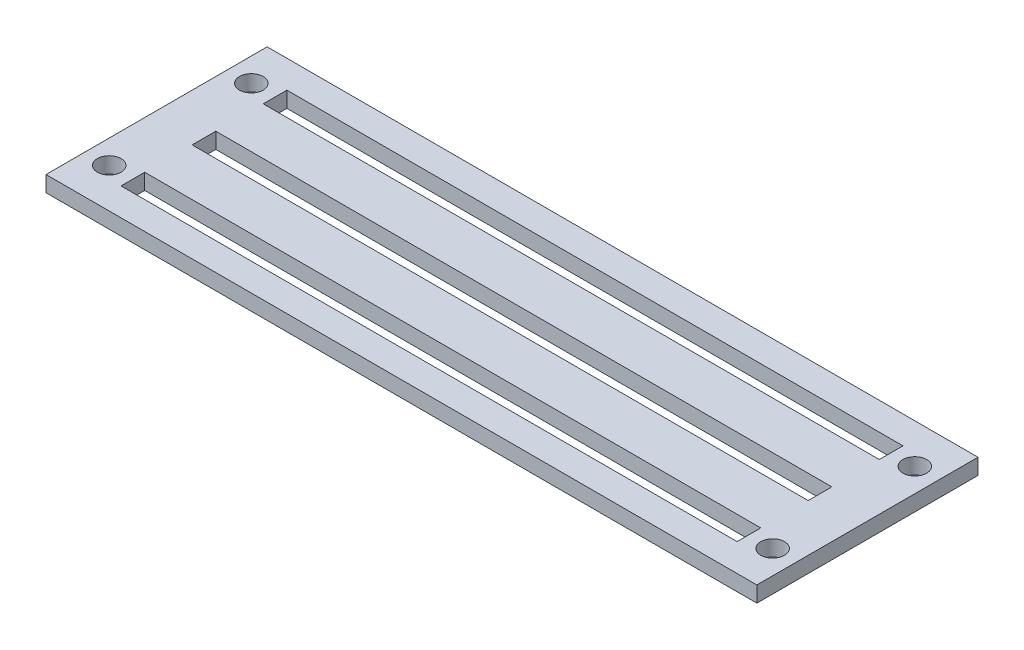
ISO-10303-21;
HEADER;
FILE_DESCRIPTION(('STEP AP214'),'2;1');
FILE_NAME('part.step','',(''),(''),'','','');
FILE_SCHEMA(('AUTOMOTIVE_DESIGN { 1 0 10303 214 1 1 1 1 }'));
ENDSEC;
DATA;
#1=APPLICATION_CONTEXT('core data for automotive mechanical design processes');
#2=APPLICATION_PROTOCOL_DEFINITION('international standard','automotive_design',2000,#1);
#3=PRODUCT_CONTEXT('',#1,'mechanical');
#4=PRODUCT('Part','Part','',(#3));
#5=PRODUCT_RELATED_PRODUCT_CATEGORY('part','',(#4));
#6=PRODUCT_DEFINITION_FORMATION('','',#4);
#7=PRODUCT_DEFINITION_CONTEXT('part definition',#1,'design');
#8=PRODUCT_DEFINITION('design','',#6,#7);
#9=PRODUCT_DEFINITION_SHAPE('','',#8);
#10=(LENGTH_UNIT() NAMED_UNIT(*) SI_UNIT(.MILLI.,.METRE.));
#11=(NAMED_UNIT(*) PLANE_ANGLE_UNIT() SI_UNIT($,.RADIAN.));
#12=(NAMED_UNIT(*) SI_UNIT($,.STERADIAN.) SOLID_ANGLE_UNIT());
#13=UNCERTAINTY_MEASURE_WITH_UNIT(LENGTH_MEASURE(1.E-05),#10,'distance_accuracy_value','');
#14=(GEOMETRIC_REPRESENTATION_CONTEXT(3) GLOBAL_UNCERTAINTY_ASSIGNED_CONTEXT((#13)) GLOBAL_UNIT_ASSIGNED_CONTEXT((#10,
#11,#12)) REPRESENTATION_CONTEXT('',''));
#15=CARTESIAN_POINT('',(0.,0.,0.));
#16=DIRECTION('',(0.,0.,1.));
#17=DIRECTION('',(1.,0.,0.));
#18=AXIS2_PLACEMENT_3D('',#15,#16,#17);
#19=CARTESIAN_POINT('',(0.,2.,0.));
#20=DIRECTION('',(1.,0.,0.));
#21=DIRECTION('',(0.,0.,-1.));
#22=AXIS2_PLACEMENT_3D('',#19,#20,#21);
#23=PLANE('',#22);
#24=DIRECTION('',(0.,0.,1.));
#25=VECTOR('',#24,1.);
#26=CARTESIAN_POINT('',(0.,0.,0.));
#27=LINE('',#26,#25);
#28=CARTESIAN_POINT('',(0.,0.,-28.));
#29=VERTEX_POINT('',#28);
#30=CARTESIAN_POINT('',(0.,0.,0.));
#31=VERTEX_POINT('',#30);
#32=EDGE_CURVE('E312',#29,#31,#27,.T.);
#33=ORIENTED_EDGE('',*,*,#32,.T.);
#34=DIRECTION('',(0.,-1.,0.));
#35=VECTOR('',#34,1.);
#36=CARTESIAN_POINT('',(0.,2.,0.));
#37=LINE('',#36,#35);
#38=CARTESIAN_POINT('',(0.,2.,0.));
#39=VERTEX_POINT('',#38);
#40=EDGE_CURVE('E11',#39,#31,#37,.T.);
#41=ORIENTED_EDGE('',*,*,#40,.F.);
#42=DIRECTION('',(0.,0.,1.));
#43=VECTOR('',#42,1.);
#44=CARTESIAN_POINT('',(0.,2.,0.));
#45=LINE('',#44,#43);
#46=CARTESIAN_POINT('',(0.,2.,-28.));
#47=VERTEX_POINT('',#46);
#48=EDGE_CURVE('E322',#47,#39,#45,.T.);
#49=ORIENTED_EDGE('',*,*,#48,.F.);
#50=DIRECTION('',(0.,-1.,0.));
#51=VECTOR('',#50,1.);
#52=CARTESIAN_POINT('',(0.,2.,-28.));
#53=LINE('',#52,#51);
#54=EDGE_CURVE('E336',#47,#29,#53,.T.);
#55=ORIENTED_EDGE('',*,*,#54,.T.);
#56=EDGE_LOOP('',(#33,#41,#49,#55));
#57=FACE_BOUND('',#56,.T.);
#58=ADVANCED_FACE('F39',(#57),#23,.F.);
#59=CARTESIAN_POINT('',(0.,2.,0.));
#60=DIRECTION('',(0.,0.,-1.));
#61=DIRECTION('',(-1.,0.,0.));
#62=AXIS2_PLACEMENT_3D('',#59,#60,#61);
#63=PLANE('',#62);
#64=DIRECTION('',(1.,0.,0.));
#65=VECTOR('',#64,1.);
#66=CARTESIAN_POINT('',(0.,0.,0.));
#67=LINE('',#66,#65);
#68=CARTESIAN_POINT('',(90.,0.,0.));
#69=VERTEX_POINT('',#68);
#70=EDGE_CURVE('E340',#31,#69,#67,.T.);
#71=ORIENTED_EDGE('',*,*,#70,.T.);
#72=DIRECTION('',(0.,-1.,0.));
#73=VECTOR('',#72,1.);
#74=CARTESIAN_POINT('',(90.,2.,0.));
#75=LINE('',#74,#73);
#76=CARTESIAN_POINT('',(90.,2.,0.));
#77=VERTEX_POINT('',#76);
#78=EDGE_CURVE('E47',#77,#69,#75,.T.);
#79=ORIENTED_EDGE('',*,*,#78,.F.);
#80=DIRECTION('',(1.,0.,0.));
#81=VECTOR('',#80,1.);
#82=CARTESIAN_POINT('',(0.,2.,0.));
#83=LINE('',#82,#81);
#84=EDGE_CURVE('E326',#39,#77,#83,.T.);
#85=ORIENTED_EDGE('',*,*,#84,.F.);
#86=ORIENTED_EDGE('',*,*,#40,.T.);
#87=EDGE_LOOP('',(#71,#79,#85,#86));
#88=FACE_BOUND('',#87,.T.);
#89=ADVANCED_FACE('F375',(#88),#63,.F.);
#90=CARTESIAN_POINT('',(90.,2.,0.));
#91=DIRECTION('',(-1.,0.,0.));
#92=DIRECTION('',(0.,0.,1.));
#93=AXIS2_PLACEMENT_3D('',#90,#91,#92);
#94=PLANE('',#93);
#95=DIRECTION('',(0.,0.,-1.));
#96=VECTOR('',#95,1.);
#97=CARTESIAN_POINT('',(90.,0.,0.));
#98=LINE('',#97,#96);
#99=CARTESIAN_POINT('',(90.,0.,-28.));
#100=VERTEX_POINT('',#99);
#101=EDGE_CURVE('E343',#69,#100,#98,.T.);
#102=ORIENTED_EDGE('',*,*,#101,.T.);
#103=DIRECTION('',(0.,-1.,0.));
#104=VECTOR('',#103,1.);
#105=CARTESIAN_POINT('',(90.,2.,-28.));
#106=LINE('',#105,#104);
#107=CARTESIAN_POINT('',(90.,2.,-28.));
#108=VERTEX_POINT('',#107);
#109=EDGE_CURVE('E351',#108,#100,#106,.T.);
#110=ORIENTED_EDGE('',*,*,#109,.F.);
#111=DIRECTION('',(0.,0.,-1.));
#112=VECTOR('',#111,1.);
#113=CARTESIAN_POINT('',(90.,2.,0.));
#114=LINE('',#113,#112);
#115=EDGE_CURVE('E330',#77,#108,#114,.T.);
#116=ORIENTED_EDGE('',*,*,#115,.F.);
#117=ORIENTED_EDGE('',*,*,#78,.T.);
#118=EDGE_LOOP('',(#102,#110,#116,#117));
#119=FACE_BOUND('',#118,.T.);
#120=ADVANCED_FACE('F360',(#119),#94,.F.);
#121=CARTESIAN_POINT('',(0.,2.,-28.));
#122=DIRECTION('',(0.,0.,1.));
#123=DIRECTION('',(1.,0.,0.));
#124=AXIS2_PLACEMENT_3D('',#121,#122,#123);
#125=PLANE('',#124);
#126=DIRECTION('',(-1.,0.,0.));
#127=VECTOR('',#126,1.);
#128=CARTESIAN_POINT('',(0.,0.,-28.));
#129=LINE('',#128,#127);
#130=EDGE_CURVE('E327',#100,#29,#129,.T.);
#131=ORIENTED_EDGE('',*,*,#130,.T.);
#132=ORIENTED_EDGE('',*,*,#54,.F.);
#133=DIRECTION('',(-1.,0.,0.));
#134=VECTOR('',#133,1.);
#135=CARTESIAN_POINT('',(0.,2.,-28.));
#136=LINE('',#135,#134);
#137=EDGE_CURVE('E333',#108,#47,#136,.T.);
#138=ORIENTED_EDGE('',*,*,#137,.F.);
#139=ORIENTED_EDGE('',*,*,#109,.T.);
#140=EDGE_LOOP('',(#131,#132,#138,#139));
#141=FACE_BOUND('',#140,.T.);
#142=ADVANCED_FACE('F368',(#141),#125,.F.);
#143=CARTESIAN_POINT('',(0.,2.,0.));
#144=DIRECTION('',(0.,-1.,0.));
#145=DIRECTION('',(0.,0.,-1.));
#146=AXIS2_PLACEMENT_3D('',#143,#144,#145);
#147=PLANE('',#146);
#148=CARTESIAN_POINT('',(3.,2.,-23.));
#149=DIRECTION('',(0.,1.,0.));
#150=DIRECTION('',(0.,0.,1.));
#151=AXIS2_PLACEMENT_3D('',#148,#149,#150);
#152=CIRCLE('',#151,1.5);
#153=CARTESIAN_POINT('',(3.,2.,-21.5));
#154=VERTEX_POINT('',#153);
#155=EDGE_CURVE('E251',#154,#154,#152,.T.);
#156=ORIENTED_EDGE('',*,*,#155,.F.);
#157=EDGE_LOOP('',(#156));
#158=FACE_BOUND('',#157,.T.);
#159=CARTESIAN_POINT('',(3.,2.,-4.99999999999999));
#160=DIRECTION('',(0.,1.,0.));
#161=DIRECTION('',(0.,0.,1.));
#162=AXIS2_PLACEMENT_3D('',#159,#160,#161);
#163=CIRCLE('',#162,1.5);
#164=CARTESIAN_POINT('',(3.,2.,-3.49999999999999));
#165=VERTEX_POINT('',#164);
#166=EDGE_CURVE('E259',#165,#165,#163,.T.);
#167=ORIENTED_EDGE('',*,*,#166,.F.);
#168=EDGE_LOOP('',(#167));
#169=FACE_BOUND('',#168,.T.);
#170=CARTESIAN_POINT('',(87.,2.,-5.));
#171=DIRECTION('',(0.,1.,0.));
#172=DIRECTION('',(0.,0.,1.));
#173=AXIS2_PLACEMENT_3D('',#170,#171,#172);
#174=CIRCLE('',#173,1.5);
#175=CARTESIAN_POINT('',(87.,2.,-3.5));
#176=VERTEX_POINT('',#175);
#177=EDGE_CURVE('E267',#176,#176,#174,.T.);
#178=ORIENTED_EDGE('',*,*,#177,.F.);
#179=EDGE_LOOP('',(#178));
#180=FACE_BOUND('',#179,.T.);
#181=CARTESIAN_POINT('',(87.,2.,-23.));
#182=DIRECTION('',(0.,1.,0.));
#183=DIRECTION('',(0.,0.,1.));
#184=AXIS2_PLACEMENT_3D('',#181,#182,#183);
#185=CIRCLE('',#184,1.5);
#186=CARTESIAN_POINT('',(87.,2.,-21.5));
#187=VERTEX_POINT('',#186);
#188=EDGE_CURVE('E199',#187,#187,#185,.T.);
#189=ORIENTED_EDGE('',*,*,#188,.F.);
#190=EDGE_LOOP('',(#189));
#191=FACE_BOUND('',#190,.T.);
#192=DIRECTION('',(-1.,0.,0.));
#193=VECTOR('',#192,1.);
#194=CARTESIAN_POINT('',(84.,2.,-6.5));
#195=LINE('',#194,#193);
#196=CARTESIAN_POINT('',(84.,2.,-6.5));
#197=VERTEX_POINT('',#196);
#198=CARTESIAN_POINT('',(6.,2.,-6.49999999999999));
#199=VERTEX_POINT('',#198);
#200=EDGE_CURVE('E189',#197,#199,#195,.T.);
#201=ORIENTED_EDGE('',*,*,#200,.F.);
#202=DIRECTION('',(0.,0.,-1.));
#203=VECTOR('',#202,1.);
#204=CARTESIAN_POINT('',(84.,2.,-6.5));
#205=LINE('',#204,#203);
#206=CARTESIAN_POINT('',(84.,2.,-3.5));
#207=VERTEX_POINT('',#206);
#208=EDGE_CURVE('E54',#207,#197,#205,.T.);
#209=ORIENTED_EDGE('',*,*,#208,.F.);
#210=DIRECTION('',(1.,0.,0.));
#211=VECTOR('',#210,1.);
#212=CARTESIAN_POINT('',(84.,2.,-3.5));
#213=LINE('',#212,#211);
#214=CARTESIAN_POINT('',(6.,2.,-3.49999999999999));
#215=VERTEX_POINT('',#214);
#216=EDGE_CURVE('E176',#215,#207,#213,.T.);
#217=ORIENTED_EDGE('',*,*,#216,.F.);
#218=DIRECTION('',(0.,0.,1.));
#219=VECTOR('',#218,1.);
#220=CARTESIAN_POINT('',(6.,2.,-6.49999999999999));
#221=LINE('',#220,#219);
#222=EDGE_CURVE('E180',#199,#215,#221,.T.);
#223=ORIENTED_EDGE('',*,*,#222,.F.);
#224=EDGE_LOOP('',(#201,#209,#217,#223));
#225=FACE_BOUND('',#224,.T.);
#226=DIRECTION('',(1.,0.,0.));
#227=VECTOR('',#226,1.);
#228=CARTESIAN_POINT('',(6.,2.,-21.5));
#229=LINE('',#228,#227);
#230=CARTESIAN_POINT('',(6.,2.,-21.5));
#231=VERTEX_POINT('',#230);
#232=CARTESIAN_POINT('',(84.,2.,-21.5));
#233=VERTEX_POINT('',#232);
#234=EDGE_CURVE('E225',#231,#233,#229,.T.);
#235=ORIENTED_EDGE('',*,*,#234,.F.);
#236=DIRECTION('',(0.,0.,1.));
#237=VECTOR('',#236,1.);
#238=CARTESIAN_POINT('',(6.,2.,-24.5));
#239=LINE('',#238,#237);
#240=CARTESIAN_POINT('',(6.,2.,-24.5));
#241=VERTEX_POINT('',#240);
#242=EDGE_CURVE('E62',#241,#231,#239,.T.);
#243=ORIENTED_EDGE('',*,*,#242,.F.);
#244=DIRECTION('',(-1.,0.,0.));
#245=VECTOR('',#244,1.);
#246=CARTESIAN_POINT('',(6.,2.,-24.5));
#247=LINE('',#246,#245);
#248=CARTESIAN_POINT('',(84.,2.,-24.5));
#249=VERTEX_POINT('',#248);
#250=EDGE_CURVE('E210',#249,#241,#247,.T.);
#251=ORIENTED_EDGE('',*,*,#250,.F.);
#252=DIRECTION('',(0.,0.,-1.));
#253=VECTOR('',#252,1.);
#254=CARTESIAN_POINT('',(84.,2.,-24.5));
#255=LINE('',#254,#253);
#256=EDGE_CURVE('E229',#233,#249,#255,.T.);
#257=ORIENTED_EDGE('',*,*,#256,.F.);
#258=EDGE_LOOP('',(#235,#243,#251,#257));
#259=FACE_BOUND('',#258,.T.);
#260=DIRECTION('',(1.,0.,0.));
#261=VECTOR('',#260,1.);
#262=CARTESIAN_POINT('',(6.,2.,-12.5));
#263=LINE('',#262,#261);
#264=CARTESIAN_POINT('',(6.,2.,-12.5));
#265=VERTEX_POINT('',#264);
#266=CARTESIAN_POINT('',(84.,2.,-12.5));
#267=VERTEX_POINT('',#266);
#268=EDGE_CURVE('E298',#265,#267,#263,.T.);
#269=ORIENTED_EDGE('',*,*,#268,.F.);
#270=DIRECTION('',(0.,0.,1.));
#271=VECTOR('',#270,1.);
#272=CARTESIAN_POINT('',(6.,2.,-15.5));
#273=LINE('',#272,#271);
#274=CARTESIAN_POINT('',(6.,2.,-15.5));
#275=VERTEX_POINT('',#274);
#276=EDGE_CURVE('E250',#275,#265,#273,.T.);
#277=ORIENTED_EDGE('',*,*,#276,.F.);
#278=DIRECTION('',(-1.,0.,0.));
#279=VECTOR('',#278,1.);
#280=CARTESIAN_POINT('',(6.,2.,-15.5));
#281=LINE('',#280,#279);
#282=CARTESIAN_POINT('',(84.,2.,-15.5));
#283=VERTEX_POINT('',#282);
#284=EDGE_CURVE('E283',#283,#275,#281,.T.);
#285=ORIENTED_EDGE('',*,*,#284,.F.);
#286=DIRECTION('',(0.,0.,-1.));
#287=VECTOR('',#286,1.);
#288=CARTESIAN_POINT('',(84.,2.,-15.5));
#289=LINE('',#288,#287);
#290=EDGE_CURVE('E302',#267,#283,#289,.T.);
#291=ORIENTED_EDGE('',*,*,#290,.F.);
#292=EDGE_LOOP('',(#269,#277,#285,#291));
#293=FACE_BOUND('',#292,.T.);
#294=ORIENTED_EDGE('',*,*,#48,.T.);
#295=ORIENTED_EDGE('',*,*,#84,.T.);
#296=ORIENTED_EDGE('',*,*,#115,.T.);
#297=ORIENTED_EDGE('',*,*,#137,.T.);
#298=EDGE_LOOP('',(#294,#295,#296,#297));
#299=FACE_BOUND('',#298,.T.);
#300=ADVANCED_FACE('F374',(#158,#169,#180,#191,#225,#259,#293,#299),#147,.F.);
#301=CARTESIAN_POINT('',(0.,0.,0.));
#302=DIRECTION('',(0.,-1.,0.));
#303=DIRECTION('',(0.,0.,-1.));
#304=AXIS2_PLACEMENT_3D('',#301,#302,#303);
#305=PLANE('',#304);
#306=CARTESIAN_POINT('',(3.,0.,-23.));
#307=DIRECTION('',(0.,1.,0.));
#308=DIRECTION('',(0.,0.,1.));
#309=AXIS2_PLACEMENT_3D('',#306,#307,#308);
#310=CIRCLE('',#309,1.5);
#311=CARTESIAN_POINT('',(3.,0.,-21.5));
#312=VERTEX_POINT('',#311);
#313=EDGE_CURVE('E246',#312,#312,#310,.T.);
#314=ORIENTED_EDGE('',*,*,#313,.T.);
#315=EDGE_LOOP('',(#314));
#316=FACE_BOUND('',#315,.T.);
#317=CARTESIAN_POINT('',(3.,0.,-4.99999999999999));
#318=DIRECTION('',(0.,1.,0.));
#319=DIRECTION('',(0.,0.,1.));
#320=AXIS2_PLACEMENT_3D('',#317,#318,#319);
#321=CIRCLE('',#320,1.5);
#322=CARTESIAN_POINT('',(3.,0.,-3.49999999999999));
#323=VERTEX_POINT('',#322);
#324=EDGE_CURVE('E255',#323,#323,#321,.T.);
#325=ORIENTED_EDGE('',*,*,#324,.T.);
#326=EDGE_LOOP('',(#325));
#327=FACE_BOUND('',#326,.T.);
#328=CARTESIAN_POINT('',(87.,0.,-5.));
#329=DIRECTION('',(0.,1.,0.));
#330=DIRECTION('',(0.,0.,1.));
#331=AXIS2_PLACEMENT_3D('',#328,#329,#330);
#332=CIRCLE('',#331,1.5);
#333=CARTESIAN_POINT('',(87.,0.,-3.5));
#334=VERTEX_POINT('',#333);
#335=EDGE_CURVE('E263',#334,#334,#332,.T.);
#336=ORIENTED_EDGE('',*,*,#335,.T.);
#337=EDGE_LOOP('',(#336));
#338=FACE_BOUND('',#337,.T.);
#339=CARTESIAN_POINT('',(87.,0.,-23.));
#340=DIRECTION('',(0.,1.,0.));
#341=DIRECTION('',(0.,0.,1.));
#342=AXIS2_PLACEMENT_3D('',#339,#340,#341);
#343=CIRCLE('',#342,1.5);
#344=CARTESIAN_POINT('',(87.,0.,-21.5));
#345=VERTEX_POINT('',#344);
#346=EDGE_CURVE('E271',#345,#345,#343,.T.);
#347=ORIENTED_EDGE('',*,*,#346,.T.);
#348=EDGE_LOOP('',(#347));
#349=FACE_BOUND('',#348,.T.);
#350=DIRECTION('',(0.,0.,-1.));
#351=VECTOR('',#350,1.);
#352=CARTESIAN_POINT('',(84.,0.,-6.5));
#353=LINE('',#352,#351);
#354=CARTESIAN_POINT('',(84.,0.,-3.5));
#355=VERTEX_POINT('',#354);
#356=CARTESIAN_POINT('',(84.,0.,-6.5));
#357=VERTEX_POINT('',#356);
#358=EDGE_CURVE('E154',#355,#357,#353,.T.);
#359=ORIENTED_EDGE('',*,*,#358,.T.);
#360=DIRECTION('',(-1.,0.,0.));
#361=VECTOR('',#360,1.);
#362=CARTESIAN_POINT('',(84.,0.,-6.5));
#363=LINE('',#362,#361);
#364=CARTESIAN_POINT('',(6.,0.,-6.49999999999999));
#365=VERTEX_POINT('',#364);
#366=EDGE_CURVE('E165',#357,#365,#363,.T.);
#367=ORIENTED_EDGE('',*,*,#366,.T.);
#368=DIRECTION('',(0.,0.,1.));
#369=VECTOR('',#368,1.);
#370=CARTESIAN_POINT('',(6.,0.,-6.49999999999999));
#371=LINE('',#370,#369);
#372=CARTESIAN_POINT('',(6.,0.,-3.49999999999999));
#373=VERTEX_POINT('',#372);
#374=EDGE_CURVE('E170',#365,#373,#371,.T.);
#375=ORIENTED_EDGE('',*,*,#374,.T.);
#376=DIRECTION('',(1.,0.,0.));
#377=VECTOR('',#376,1.);
#378=CARTESIAN_POINT('',(84.,0.,-3.5));
#379=LINE('',#378,#377);
#380=EDGE_CURVE('E161',#373,#355,#379,.T.);
#381=ORIENTED_EDGE('',*,*,#380,.T.);
#382=EDGE_LOOP('',(#359,#367,#375,#381));
#383=FACE_BOUND('',#382,.T.);
#384=DIRECTION('',(0.,0.,1.));
#385=VECTOR('',#384,1.);
#386=CARTESIAN_POINT('',(6.,0.,-24.5));
#387=LINE('',#386,#385);
#388=CARTESIAN_POINT('',(6.,0.,-24.5));
#389=VERTEX_POINT('',#388);
#390=CARTESIAN_POINT('',(6.,0.,-21.5));
#391=VERTEX_POINT('',#390);
#392=EDGE_CURVE('E205',#389,#391,#387,.T.);
#393=ORIENTED_EDGE('',*,*,#392,.T.);
#394=DIRECTION('',(1.,0.,0.));
#395=VECTOR('',#394,1.);
#396=CARTESIAN_POINT('',(6.,0.,-21.5));
#397=LINE('',#396,#395);
#398=CARTESIAN_POINT('',(84.,0.,-21.5));
#399=VERTEX_POINT('',#398);
#400=EDGE_CURVE('E209',#391,#399,#397,.T.);
#401=ORIENTED_EDGE('',*,*,#400,.T.);
#402=DIRECTION('',(0.,0.,-1.));
#403=VECTOR('',#402,1.);
#404=CARTESIAN_POINT('',(84.,0.,-24.5));
#405=LINE('',#404,#403);
#406=CARTESIAN_POINT('',(84.,0.,-24.5));
#407=VERTEX_POINT('',#406);
#408=EDGE_CURVE('E214',#399,#407,#405,.T.);
#409=ORIENTED_EDGE('',*,*,#408,.T.);
#410=DIRECTION('',(-1.,0.,0.));
#411=VECTOR('',#410,1.);
#412=CARTESIAN_POINT('',(6.,0.,-24.5));
#413=LINE('',#412,#411);
#414=EDGE_CURVE('E218',#407,#389,#413,.T.);
#415=ORIENTED_EDGE('',*,*,#414,.T.);
#416=EDGE_LOOP('',(#393,#401,#409,#415));
#417=FACE_BOUND('',#416,.T.);
#418=DIRECTION('',(0.,0.,1.));
#419=VECTOR('',#418,1.);
#420=CARTESIAN_POINT('',(6.,0.,-15.5));
#421=LINE('',#420,#419);
#422=CARTESIAN_POINT('',(6.,0.,-15.5));
#423=VERTEX_POINT('',#422);
#424=CARTESIAN_POINT('',(6.,0.,-12.5));
#425=VERTEX_POINT('',#424);
#426=EDGE_CURVE('E278',#423,#425,#421,.T.);
#427=ORIENTED_EDGE('',*,*,#426,.T.);
#428=DIRECTION('',(1.,0.,0.));
#429=VECTOR('',#428,1.);
#430=CARTESIAN_POINT('',(6.,0.,-12.5));
#431=LINE('',#430,#429);
#432=CARTESIAN_POINT('',(84.,0.,-12.5));
#433=VERTEX_POINT('',#432);
#434=EDGE_CURVE('E282',#425,#433,#431,.T.);
#435=ORIENTED_EDGE('',*,*,#434,.T.);
#436=DIRECTION('',(0.,0.,-1.));
#437=VECTOR('',#436,1.);
#438=CARTESIAN_POINT('',(84.,0.,-15.5));
#439=LINE('',#438,#437);
#440=CARTESIAN_POINT('',(84.,0.,-15.5));
#441=VERTEX_POINT('',#440);
#442=EDGE_CURVE('E287',#433,#441,#439,.T.);
#443=ORIENTED_EDGE('',*,*,#442,.T.);
#444=DIRECTION('',(-1.,0.,0.));
#445=VECTOR('',#444,1.);
#446=CARTESIAN_POINT('',(6.,0.,-15.5));
#447=LINE('',#446,#445);
#448=EDGE_CURVE('E291',#441,#423,#447,.T.);
#449=ORIENTED_EDGE('',*,*,#448,.T.);
#450=EDGE_LOOP('',(#427,#435,#443,#449));
#451=FACE_BOUND('',#450,.T.);
#452=ORIENTED_EDGE('',*,*,#32,.F.);
#453=ORIENTED_EDGE('',*,*,#130,.F.);
#454=ORIENTED_EDGE('',*,*,#101,.F.);
#455=ORIENTED_EDGE('',*,*,#70,.F.);
#456=EDGE_LOOP('',(#452,#453,#454,#455));
#457=FACE_BOUND('',#456,.T.);
#458=ADVANCED_FACE('F172',(#316,#327,#338,#349,#383,#417,#451,#457),#305,.T.);
#459=CARTESIAN_POINT('',(6.,0.,-15.5));
#460=DIRECTION('',(-1.,0.,0.));
#461=DIRECTION('',(0.,0.,1.));
#462=AXIS2_PLACEMENT_3D('',#459,#460,#461);
#463=PLANE('',#462);
#464=ORIENTED_EDGE('',*,*,#276,.T.);
#465=DIRECTION('',(0.,1.,0.));
#466=VECTOR('',#465,1.);
#467=CARTESIAN_POINT('',(6.,0.,-12.5));
#468=LINE('',#467,#466);
#469=EDGE_CURVE('E295',#425,#265,#468,.T.);
#470=ORIENTED_EDGE('',*,*,#469,.F.);
#471=ORIENTED_EDGE('',*,*,#426,.F.);
#472=DIRECTION('',(0.,1.,0.));
#473=VECTOR('',#472,1.);
#474=CARTESIAN_POINT('',(6.,0.,-15.5));
#475=LINE('',#474,#473);
#476=EDGE_CURVE('E309',#423,#275,#475,.T.);
#477=ORIENTED_EDGE('',*,*,#476,.T.);
#478=EDGE_LOOP('',(#464,#470,#471,#477));
#479=FACE_BOUND('',#478,.T.);
#480=ADVANCED_FACE('F387',(#479),#463,.F.);
#481=CARTESIAN_POINT('',(6.,0.,-15.5));
#482=DIRECTION('',(0.,0.,-1.));
#483=DIRECTION('',(-1.,0.,0.));
#484=AXIS2_PLACEMENT_3D('',#481,#482,#483);
#485=PLANE('',#484);
#486=ORIENTED_EDGE('',*,*,#284,.T.);
#487=ORIENTED_EDGE('',*,*,#476,.F.);
#488=ORIENTED_EDGE('',*,*,#448,.F.);
#489=DIRECTION('',(0.,1.,0.));
#490=VECTOR('',#489,1.);
#491=CARTESIAN_POINT('',(84.,0.,-15.5));
#492=LINE('',#491,#490);
#493=EDGE_CURVE('E313',#441,#283,#492,.T.);
#494=ORIENTED_EDGE('',*,*,#493,.T.);
#495=EDGE_LOOP('',(#486,#487,#488,#494));
#496=FACE_BOUND('',#495,.T.);
#497=ADVANCED_FACE('F394',(#496),#485,.F.);
#498=CARTESIAN_POINT('',(84.,0.,-15.5));
#499=DIRECTION('',(1.,0.,0.));
#500=DIRECTION('',(0.,0.,-1.));
#501=AXIS2_PLACEMENT_3D('',#498,#499,#500);
#502=PLANE('',#501);
#503=ORIENTED_EDGE('',*,*,#290,.T.);
#504=ORIENTED_EDGE('',*,*,#493,.F.);
#505=ORIENTED_EDGE('',*,*,#442,.F.);
#506=DIRECTION('',(0.,1.,0.));
#507=VECTOR('',#506,1.);
#508=CARTESIAN_POINT('',(84.,0.,-12.5));
#509=LINE('',#508,#507);
#510=EDGE_CURVE('E316',#433,#267,#509,.T.);
#511=ORIENTED_EDGE('',*,*,#510,.T.);
#512=EDGE_LOOP('',(#503,#504,#505,#511));
#513=FACE_BOUND('',#512,.T.);
#514=ADVANCED_FACE('F400',(#513),#502,.F.);
#515=CARTESIAN_POINT('',(6.,0.,-12.5));
#516=DIRECTION('',(0.,0.,1.));
#517=DIRECTION('',(1.,0.,0.));
#518=AXIS2_PLACEMENT_3D('',#515,#516,#517);
#519=PLANE('',#518);
#520=ORIENTED_EDGE('',*,*,#268,.T.);
#521=ORIENTED_EDGE('',*,*,#510,.F.);
#522=ORIENTED_EDGE('',*,*,#434,.F.);
#523=ORIENTED_EDGE('',*,*,#469,.T.);
#524=EDGE_LOOP('',(#520,#521,#522,#523));
#525=FACE_BOUND('',#524,.T.);
#526=ADVANCED_FACE('F396',(#525),#519,.F.);
#527=CARTESIAN_POINT('',(6.,0.,-24.5));
#528=DIRECTION('',(-1.,0.,0.));
#529=DIRECTION('',(0.,0.,1.));
#530=AXIS2_PLACEMENT_3D('',#527,#528,#529);
#531=PLANE('',#530);
#532=ORIENTED_EDGE('',*,*,#242,.T.);
#533=DIRECTION('',(0.,1.,0.));
#534=VECTOR('',#533,1.);
#535=CARTESIAN_POINT('',(6.,0.,-21.5));
#536=LINE('',#535,#534);
#537=EDGE_CURVE('E222',#391,#231,#536,.T.);
#538=ORIENTED_EDGE('',*,*,#537,.F.);
#539=ORIENTED_EDGE('',*,*,#392,.F.);
#540=DIRECTION('',(0.,1.,0.));
#541=VECTOR('',#540,1.);
#542=CARTESIAN_POINT('',(6.,0.,-24.5));
#543=LINE('',#542,#541);
#544=EDGE_CURVE('E190',#389,#241,#543,.T.);
#545=ORIENTED_EDGE('',*,*,#544,.T.);
#546=EDGE_LOOP('',(#532,#538,#539,#545));
#547=FACE_BOUND('',#546,.T.);
#548=ADVANCED_FACE('F399',(#547),#531,.F.);
#549=CARTESIAN_POINT('',(6.,0.,-24.5));
#550=DIRECTION('',(0.,0.,-1.));
#551=DIRECTION('',(-1.,0.,0.));
#552=AXIS2_PLACEMENT_3D('',#549,#550,#551);
#553=PLANE('',#552);
#554=ORIENTED_EDGE('',*,*,#250,.T.);
#555=ORIENTED_EDGE('',*,*,#544,.F.);
#556=ORIENTED_EDGE('',*,*,#414,.F.);
#557=DIRECTION('',(0.,1.,0.));
#558=VECTOR('',#557,1.);
#559=CARTESIAN_POINT('',(84.,0.,-24.5));
#560=LINE('',#559,#558);
#561=EDGE_CURVE('E238',#407,#249,#560,.T.);
#562=ORIENTED_EDGE('',*,*,#561,.T.);
#563=EDGE_LOOP('',(#554,#555,#556,#562));
#564=FACE_BOUND('',#563,.T.);
#565=ADVANCED_FACE('F426',(#564),#553,.F.);
#566=CARTESIAN_POINT('',(84.,0.,-24.5));
#567=DIRECTION('',(1.,0.,0.));
#568=DIRECTION('',(0.,0.,-1.));
#569=AXIS2_PLACEMENT_3D('',#566,#567,#568);
#570=PLANE('',#569);
#571=ORIENTED_EDGE('',*,*,#256,.T.);
#572=ORIENTED_EDGE('',*,*,#561,.F.);
#573=ORIENTED_EDGE('',*,*,#408,.F.);
#574=DIRECTION('',(0.,1.,0.));
#575=VECTOR('',#574,1.);
#576=CARTESIAN_POINT('',(84.,0.,-21.5));
#577=LINE('',#576,#575);
#578=EDGE_CURVE('E241',#399,#233,#577,.T.);
#579=ORIENTED_EDGE('',*,*,#578,.T.);
#580=EDGE_LOOP('',(#571,#572,#573,#579));
#581=FACE_BOUND('',#580,.T.);
#582=ADVANCED_FACE('F430',(#581),#570,.F.);
#583=CARTESIAN_POINT('',(6.,0.,-21.5));
#584=DIRECTION('',(0.,0.,1.));
#585=DIRECTION('',(1.,0.,0.));
#586=AXIS2_PLACEMENT_3D('',#583,#584,#585);
#587=PLANE('',#586);
#588=ORIENTED_EDGE('',*,*,#234,.T.);
#589=ORIENTED_EDGE('',*,*,#578,.F.);
#590=ORIENTED_EDGE('',*,*,#400,.F.);
#591=ORIENTED_EDGE('',*,*,#537,.T.);
#592=EDGE_LOOP('',(#588,#589,#590,#591));
#593=FACE_BOUND('',#592,.T.);
#594=ADVANCED_FACE('F427',(#593),#587,.F.);
#595=CARTESIAN_POINT('',(84.,0.,-6.5));
#596=DIRECTION('',(1.,0.,0.));
#597=DIRECTION('',(0.,0.,-1.));
#598=AXIS2_PLACEMENT_3D('',#595,#596,#597);
#599=PLANE('',#598);
#600=ORIENTED_EDGE('',*,*,#208,.T.);
#601=DIRECTION('',(0.,1.,0.));
#602=VECTOR('',#601,1.);
#603=CARTESIAN_POINT('',(84.,0.,-6.5));
#604=LINE('',#603,#602);
#605=EDGE_CURVE('E150',#357,#197,#604,.T.);
#606=ORIENTED_EDGE('',*,*,#605,.F.);
#607=ORIENTED_EDGE('',*,*,#358,.F.);
#608=DIRECTION('',(0.,1.,0.));
#609=VECTOR('',#608,1.);
#610=CARTESIAN_POINT('',(84.,0.,-3.5));
#611=LINE('',#610,#609);
#612=EDGE_CURVE('E196',#355,#207,#611,.T.);
#613=ORIENTED_EDGE('',*,*,#612,.T.);
#614=EDGE_LOOP('',(#600,#606,#607,#613));
#615=FACE_BOUND('',#614,.T.);
#616=ADVANCED_FACE('F152',(#615),#599,.F.);
#617=CARTESIAN_POINT('',(84.,0.,-3.5));
#618=DIRECTION('',(0.,0.,1.));
#619=DIRECTION('',(1.,0.,0.));
#620=AXIS2_PLACEMENT_3D('',#617,#618,#619);
#621=PLANE('',#620);
#622=ORIENTED_EDGE('',*,*,#216,.T.);
#623=ORIENTED_EDGE('',*,*,#612,.F.);
#624=ORIENTED_EDGE('',*,*,#380,.F.);
#625=DIRECTION('',(0.,1.,0.));
#626=VECTOR('',#625,1.);
#627=CARTESIAN_POINT('',(6.,0.,-3.49999999999999));
#628=LINE('',#627,#626);
#629=EDGE_CURVE('E200',#373,#215,#628,.T.);
#630=ORIENTED_EDGE('',*,*,#629,.T.);
#631=EDGE_LOOP('',(#622,#623,#624,#630));
#632=FACE_BOUND('',#631,.T.);
#633=ADVANCED_FACE('F440',(#632),#621,.F.);
#634=CARTESIAN_POINT('',(6.,0.,-6.49999999999999));
#635=DIRECTION('',(-1.,0.,0.));
#636=DIRECTION('',(0.,0.,1.));
#637=AXIS2_PLACEMENT_3D('',#634,#635,#636);
#638=PLANE('',#637);
#639=ORIENTED_EDGE('',*,*,#222,.T.);
#640=ORIENTED_EDGE('',*,*,#629,.F.);
#641=ORIENTED_EDGE('',*,*,#374,.F.);
#642=DIRECTION('',(0.,1.,0.));
#643=VECTOR('',#642,1.);
#644=CARTESIAN_POINT('',(6.,0.,-6.49999999999999));
#645=LINE('',#644,#643);
#646=EDGE_CURVE('E160',#365,#199,#645,.T.);
#647=ORIENTED_EDGE('',*,*,#646,.T.);
#648=EDGE_LOOP('',(#639,#640,#641,#647));
#649=FACE_BOUND('',#648,.T.);
#650=ADVANCED_FACE('F443',(#649),#638,.F.);
#651=CARTESIAN_POINT('',(84.,0.,-6.5));
#652=DIRECTION('',(0.,0.,-1.));
#653=DIRECTION('',(-1.,0.,0.));
#654=AXIS2_PLACEMENT_3D('',#651,#652,#653);
#655=PLANE('',#654);
#656=ORIENTED_EDGE('',*,*,#200,.T.);
#657=ORIENTED_EDGE('',*,*,#646,.F.);
#658=ORIENTED_EDGE('',*,*,#366,.F.);
#659=ORIENTED_EDGE('',*,*,#605,.T.);
#660=EDGE_LOOP('',(#656,#657,#658,#659));
#661=FACE_BOUND('',#660,.T.);
#662=ADVANCED_FACE('F166',(#661),#655,.F.);
#663=CARTESIAN_POINT('',(87.,0.,-23.));
#664=DIRECTION('',(0.,1.,0.));
#665=DIRECTION('',(0.,0.,1.));
#666=AXIS2_PLACEMENT_3D('',#663,#664,#665);
#667=CYLINDRICAL_SURFACE('',#666,1.5);
#668=ORIENTED_EDGE('',*,*,#346,.F.);
#669=EDGE_LOOP('',(#668));
#670=FACE_BOUND('',#669,.T.);
#671=ORIENTED_EDGE('',*,*,#188,.T.);
#672=EDGE_LOOP('',(#671));
#673=FACE_BOUND('',#672,.T.);
#674=ADVANCED_FACE('F408',(#670,#673),#667,.F.);
#675=CARTESIAN_POINT('',(87.,0.,-5.));
#676=DIRECTION('',(0.,1.,0.));
#677=DIRECTION('',(0.,0.,1.));
#678=AXIS2_PLACEMENT_3D('',#675,#676,#677);
#679=CYLINDRICAL_SURFACE('',#678,1.5);
#680=ORIENTED_EDGE('',*,*,#335,.F.);
#681=EDGE_LOOP('',(#680));
#682=FACE_BOUND('',#681,.T.);
#683=ORIENTED_EDGE('',*,*,#177,.T.);
#684=EDGE_LOOP('',(#683));
#685=FACE_BOUND('',#684,.T.);
#686=ADVANCED_FACE('F411',(#682,#685),#679,.F.);
#687=CARTESIAN_POINT('',(3.,0.,-4.99999999999999));
#688=DIRECTION('',(0.,1.,0.));
#689=DIRECTION('',(0.,0.,1.));
#690=AXIS2_PLACEMENT_3D('',#687,#688,#689);
#691=CYLINDRICAL_SURFACE('',#690,1.5);
#692=ORIENTED_EDGE('',*,*,#324,.F.);
#693=EDGE_LOOP('',(#692));
#694=FACE_BOUND('',#693,.T.);
#695=ORIENTED_EDGE('',*,*,#166,.T.);
#696=EDGE_LOOP('',(#695));
#697=FACE_BOUND('',#696,.T.);
#698=ADVANCED_FACE('F415',(#694,#697),#691,.F.);
#699=CARTESIAN_POINT('',(3.,0.,-23.));
#700=DIRECTION('',(0.,1.,0.));
#701=DIRECTION('',(0.,0.,1.));
#702=AXIS2_PLACEMENT_3D('',#699,#700,#701);
#703=CYLINDRICAL_SURFACE('',#702,1.5);
#704=ORIENTED_EDGE('',*,*,#313,.F.);
#705=EDGE_LOOP('',(#704));
#706=FACE_BOUND('',#705,.T.);
#707=ORIENTED_EDGE('',*,*,#155,.T.);
#708=EDGE_LOOP('',(#707));
#709=FACE_BOUND('',#708,.T.);
#710=ADVANCED_FACE('F419',(#706,#709),#703,.F.);
#711=CLOSED_SHELL('',(#58,#89,#120,#142,#300,#458,#480,#497,#514,#526,#548,#565,#582,#594,#616,
#633,#650,#662,#674,#686,#698,#710));
#712=MANIFOLD_SOLID_BREP('B2',#711);
#713=ADVANCED_BREP_SHAPE_REPRESENTATION('',(#18,#712),#14);
#714=SHAPE_DEFINITION_REPRESENTATION(#9,#713);
ENDSEC;
END-ISO-10303-21;
